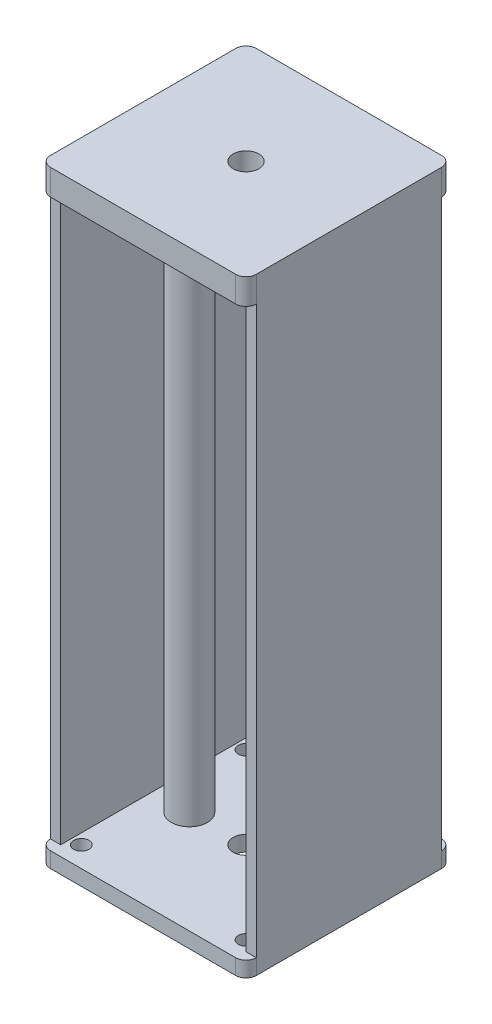
ISO-10303-21;
HEADER;
FILE_DESCRIPTION(('STEP AP214'),'2;1');
FILE_NAME('part.step','',(''),(''),'','','');
FILE_SCHEMA(('AUTOMOTIVE_DESIGN { 1 0 10303 214 1 1 1 1 }'));
ENDSEC;
DATA;
#1=APPLICATION_CONTEXT('core data for automotive mechanical design processes');
#2=APPLICATION_PROTOCOL_DEFINITION('international standard','automotive_design',2000,#1);
#3=PRODUCT_CONTEXT('',#1,'mechanical');
#4=PRODUCT('Part','Part','',(#3));
#5=PRODUCT_RELATED_PRODUCT_CATEGORY('part','',(#4));
#6=PRODUCT_DEFINITION_FORMATION('','',#4);
#7=PRODUCT_DEFINITION_CONTEXT('part definition',#1,'design');
#8=PRODUCT_DEFINITION('design','',#6,#7);
#9=PRODUCT_DEFINITION_SHAPE('','',#8);
#10=(LENGTH_UNIT() NAMED_UNIT(*) SI_UNIT(.MILLI.,.METRE.));
#11=(NAMED_UNIT(*) PLANE_ANGLE_UNIT() SI_UNIT($,.RADIAN.));
#12=(NAMED_UNIT(*) SI_UNIT($,.STERADIAN.) SOLID_ANGLE_UNIT());
#13=UNCERTAINTY_MEASURE_WITH_UNIT(LENGTH_MEASURE(1.E-05),#10,'distance_accuracy_value','');
#14=(GEOMETRIC_REPRESENTATION_CONTEXT(3) GLOBAL_UNCERTAINTY_ASSIGNED_CONTEXT((#13)) GLOBAL_UNIT_ASSIGNED_CONTEXT((#10,
#11,#12)) REPRESENTATION_CONTEXT('',''));
#15=CARTESIAN_POINT('',(0.,0.,0.));
#16=DIRECTION('',(0.,0.,1.));
#17=DIRECTION('',(1.,0.,0.));
#18=AXIS2_PLACEMENT_3D('',#15,#16,#17);
#19=CARTESIAN_POINT('',(0.,0.,0.));
#20=DIRECTION('',(0.,1.,0.));
#21=DIRECTION('',(0.,0.,1.));
#22=AXIS2_PLACEMENT_3D('',#19,#20,#21);
#23=PLANE('',#22);
#24=CARTESIAN_POINT('',(9.,0.,20.));
#25=DIRECTION('',(0.,1.,0.));
#26=DIRECTION('',(0.,0.,1.));
#27=AXIS2_PLACEMENT_3D('',#24,#25,#26);
#28=CIRCLE('',#27,3.5);
#29=CARTESIAN_POINT('',(9.,0.,23.5));
#30=VERTEX_POINT('',#29);
#31=EDGE_CURVE('E11',#30,#30,#28,.F.);
#32=ORIENTED_EDGE('',*,*,#31,.F.);
#33=EDGE_LOOP('',(#32));
#34=FACE_BOUND('',#33,.T.);
#35=CARTESIAN_POINT('',(31.,0.,20.));
#36=DIRECTION('',(0.,1.,0.));
#37=DIRECTION('',(0.,0.,1.));
#38=AXIS2_PLACEMENT_3D('',#35,#36,#37);
#39=CIRCLE('',#38,3.5);
#40=CARTESIAN_POINT('',(31.,0.,23.5));
#41=VERTEX_POINT('',#40);
#42=EDGE_CURVE('E49',#41,#41,#39,.F.);
#43=ORIENTED_EDGE('',*,*,#42,.F.);
#44=EDGE_LOOP('',(#43));
#45=FACE_BOUND('',#44,.T.);
#46=CARTESIAN_POINT('',(20.,0.,20.));
#47=DIRECTION('',(0.,1.,0.));
#48=DIRECTION('',(0.,0.,1.));
#49=AXIS2_PLACEMENT_3D('',#46,#47,#48);
#50=CIRCLE('',#49,2.5);
#51=CARTESIAN_POINT('',(20.,0.,22.5));
#52=VERTEX_POINT('',#51);
#53=EDGE_CURVE('E684',#52,#52,#50,.T.);
#54=ORIENTED_EDGE('',*,*,#53,.T.);
#55=EDGE_LOOP('',(#54));
#56=FACE_BOUND('',#55,.T.);
#57=DIRECTION('',(-1.,0.,0.));
#58=VECTOR('',#57,1.);
#59=CARTESIAN_POINT('',(2.,0.,38.));
#60=LINE('',#59,#58);
#61=CARTESIAN_POINT('',(2.,0.,38.));
#62=VERTEX_POINT('',#61);
#63=CARTESIAN_POINT('',(0.,0.,38.));
#64=VERTEX_POINT('',#63);
#65=EDGE_CURVE('E338',#62,#64,#60,.T.);
#66=ORIENTED_EDGE('',*,*,#65,.F.);
#67=DIRECTION('',(0.,0.,1.));
#68=VECTOR('',#67,1.);
#69=CARTESIAN_POINT('',(2.,0.,2.));
#70=LINE('',#69,#68);
#71=CARTESIAN_POINT('',(2.,0.,2.));
#72=VERTEX_POINT('',#71);
#73=EDGE_CURVE('E334',#72,#62,#70,.T.);
#74=ORIENTED_EDGE('',*,*,#73,.F.);
#75=DIRECTION('',(1.,0.,0.));
#76=VECTOR('',#75,1.);
#77=CARTESIAN_POINT('',(0.,0.,2.));
#78=LINE('',#77,#76);
#79=CARTESIAN_POINT('',(0.,0.,2.));
#80=VERTEX_POINT('',#79);
#81=EDGE_CURVE('E344',#80,#72,#78,.T.);
#82=ORIENTED_EDGE('',*,*,#81,.F.);
#83=CARTESIAN_POINT('',(2.,0.,2.));
#84=DIRECTION('',(0.,1.,0.));
#85=DIRECTION('',(0.,0.,1.));
#86=AXIS2_PLACEMENT_3D('',#83,#84,#85);
#87=CIRCLE('',#86,2.);
#88=CARTESIAN_POINT('',(2.,0.,0.));
#89=VERTEX_POINT('',#88);
#90=EDGE_CURVE('E251',#80,#89,#87,.F.);
#91=ORIENTED_EDGE('',*,*,#90,.T.);
#92=DIRECTION('',(-1.,0.,0.));
#93=VECTOR('',#92,1.);
#94=CARTESIAN_POINT('',(40.,0.,0.));
#95=LINE('',#94,#93);
#96=CARTESIAN_POINT('',(38.,0.,0.));
#97=VERTEX_POINT('',#96);
#98=EDGE_CURVE('E239',#97,#89,#95,.T.);
#99=ORIENTED_EDGE('',*,*,#98,.F.);
#100=CARTESIAN_POINT('',(38.,0.,2.));
#101=DIRECTION('',(0.,1.,0.));
#102=DIRECTION('',(0.,0.,1.));
#103=AXIS2_PLACEMENT_3D('',#100,#101,#102);
#104=CIRCLE('',#103,2.);
#105=CARTESIAN_POINT('',(40.,0.,2.));
#106=VERTEX_POINT('',#105);
#107=EDGE_CURVE('E255',#97,#106,#104,.F.);
#108=ORIENTED_EDGE('',*,*,#107,.T.);
#109=DIRECTION('',(1.,0.,0.));
#110=VECTOR('',#109,1.);
#111=CARTESIAN_POINT('',(38.,0.,2.));
#112=LINE('',#111,#110);
#113=CARTESIAN_POINT('',(38.,0.,2.));
#114=VERTEX_POINT('',#113);
#115=EDGE_CURVE('E212',#114,#106,#112,.T.);
#116=ORIENTED_EDGE('',*,*,#115,.F.);
#117=DIRECTION('',(0.,0.,-1.));
#118=VECTOR('',#117,1.);
#119=CARTESIAN_POINT('',(38.,0.,38.));
#120=LINE('',#119,#118);
#121=CARTESIAN_POINT('',(38.,0.,38.));
#122=VERTEX_POINT('',#121);
#123=EDGE_CURVE('E362',#122,#114,#120,.T.);
#124=ORIENTED_EDGE('',*,*,#123,.F.);
#125=DIRECTION('',(-1.,0.,0.));
#126=VECTOR('',#125,1.);
#127=CARTESIAN_POINT('',(40.,0.,38.));
#128=LINE('',#127,#126);
#129=CARTESIAN_POINT('',(40.,0.,38.));
#130=VERTEX_POINT('',#129);
#131=EDGE_CURVE('E225',#130,#122,#128,.T.);
#132=ORIENTED_EDGE('',*,*,#131,.F.);
#133=CARTESIAN_POINT('',(38.,0.,38.));
#134=DIRECTION('',(0.,1.,0.));
#135=DIRECTION('',(0.,0.,1.));
#136=AXIS2_PLACEMENT_3D('',#133,#134,#135);
#137=CIRCLE('',#136,2.);
#138=CARTESIAN_POINT('',(38.,0.,40.));
#139=VERTEX_POINT('',#138);
#140=EDGE_CURVE('E249',#130,#139,#137,.F.);
#141=ORIENTED_EDGE('',*,*,#140,.T.);
#142=DIRECTION('',(1.,0.,0.));
#143=VECTOR('',#142,1.);
#144=CARTESIAN_POINT('',(0.,0.,40.));
#145=LINE('',#144,#143);
#146=CARTESIAN_POINT('',(2.,0.,40.));
#147=VERTEX_POINT('',#146);
#148=EDGE_CURVE('E229',#147,#139,#145,.T.);
#149=ORIENTED_EDGE('',*,*,#148,.F.);
#150=CARTESIAN_POINT('',(2.,0.,38.));
#151=DIRECTION('',(0.,1.,0.));
#152=DIRECTION('',(0.,0.,1.));
#153=AXIS2_PLACEMENT_3D('',#150,#151,#152);
#154=CIRCLE('',#153,2.);
#155=EDGE_CURVE('E257',#147,#64,#154,.F.);
#156=ORIENTED_EDGE('',*,*,#155,.T.);
#157=EDGE_LOOP('',(#66,#74,#82,#91,#99,#108,#116,#124,#132,#141,#149,#156));
#158=FACE_BOUND('',#157,.T.);
#159=ADVANCED_FACE('F41',(#34,#45,#56,#158),#23,.F.);
#160=CARTESIAN_POINT('',(40.,5.,0.));
#161=DIRECTION('',(0.,0.,1.));
#162=DIRECTION('',(1.,0.,0.));
#163=AXIS2_PLACEMENT_3D('',#160,#161,#162);
#164=PLANE('',#163);
#165=ORIENTED_EDGE('',*,*,#98,.T.);
#166=DIRECTION('',(0.,-1.,0.));
#167=VECTOR('',#166,1.);
#168=CARTESIAN_POINT('',(2.,5.,0.));
#169=LINE('',#168,#167);
#170=CARTESIAN_POINT('',(2.,5.,0.));
#171=VERTEX_POINT('',#170);
#172=EDGE_CURVE('E274',#89,#171,#169,.F.);
#173=ORIENTED_EDGE('',*,*,#172,.T.);
#174=DIRECTION('',(-1.,0.,0.));
#175=VECTOR('',#174,1.);
#176=CARTESIAN_POINT('',(40.,5.,0.));
#177=LINE('',#176,#175);
#178=CARTESIAN_POINT('',(38.,5.,0.));
#179=VERTEX_POINT('',#178);
#180=EDGE_CURVE('E228',#179,#171,#177,.T.);
#181=ORIENTED_EDGE('',*,*,#180,.F.);
#182=DIRECTION('',(0.,-1.,0.));
#183=VECTOR('',#182,1.);
#184=CARTESIAN_POINT('',(38.,5.,0.));
#185=LINE('',#184,#183);
#186=EDGE_CURVE('E272',#179,#97,#185,.T.);
#187=ORIENTED_EDGE('',*,*,#186,.T.);
#188=EDGE_LOOP('',(#165,#173,#181,#187));
#189=FACE_BOUND('',#188,.T.);
#190=ADVANCED_FACE('F433',(#189),#164,.F.);
#191=CARTESIAN_POINT('',(0.,5.,0.));
#192=DIRECTION('',(1.,0.,0.));
#193=DIRECTION('',(0.,0.,-1.));
#194=AXIS2_PLACEMENT_3D('',#191,#192,#193);
#195=PLANE('',#194);
#196=DIRECTION('',(0.,1.,0.));
#197=VECTOR('',#196,1.);
#198=CARTESIAN_POINT('',(0.,-110.,2.));
#199=LINE('',#198,#197);
#200=CARTESIAN_POINT('',(0.,-110.,2.));
#201=VERTEX_POINT('',#200);
#202=EDGE_CURVE('E354',#201,#80,#199,.T.);
#203=ORIENTED_EDGE('',*,*,#202,.F.);
#204=DIRECTION('',(0.,1.,0.));
#205=VECTOR('',#204,1.);
#206=CARTESIAN_POINT('',(0.,5.,2.));
#207=LINE('',#206,#205);
#208=CARTESIAN_POINT('',(0.,-113.,2.));
#209=VERTEX_POINT('',#208);
#210=EDGE_CURVE('E292',#201,#209,#207,.F.);
#211=ORIENTED_EDGE('',*,*,#210,.T.);
#212=DIRECTION('',(0.,0.,-1.));
#213=VECTOR('',#212,1.);
#214=CARTESIAN_POINT('',(0.,-113.,0.));
#215=LINE('',#214,#213);
#216=CARTESIAN_POINT('',(0.,-113.,38.));
#217=VERTEX_POINT('',#216);
#218=EDGE_CURVE('E324',#217,#209,#215,.T.);
#219=ORIENTED_EDGE('',*,*,#218,.F.);
#220=DIRECTION('',(0.,1.,0.));
#221=VECTOR('',#220,1.);
#222=CARTESIAN_POINT('',(0.,5.,38.));
#223=LINE('',#222,#221);
#224=CARTESIAN_POINT('',(0.,-110.,38.));
#225=VERTEX_POINT('',#224);
#226=EDGE_CURVE('E286',#217,#225,#223,.T.);
#227=ORIENTED_EDGE('',*,*,#226,.T.);
#228=DIRECTION('',(0.,1.,0.));
#229=VECTOR('',#228,1.);
#230=CARTESIAN_POINT('',(0.,-110.,38.));
#231=LINE('',#230,#229);
#232=EDGE_CURVE('E243',#225,#64,#231,.T.);
#233=ORIENTED_EDGE('',*,*,#232,.T.);
#234=DIRECTION('',(0.,-1.,0.));
#235=VECTOR('',#234,1.);
#236=CARTESIAN_POINT('',(0.,5.,38.));
#237=LINE('',#236,#235);
#238=CARTESIAN_POINT('',(0.,5.,38.));
#239=VERTEX_POINT('',#238);
#240=EDGE_CURVE('E262',#64,#239,#237,.F.);
#241=ORIENTED_EDGE('',*,*,#240,.T.);
#242=DIRECTION('',(0.,0.,1.));
#243=VECTOR('',#242,1.);
#244=CARTESIAN_POINT('',(0.,5.,0.));
#245=LINE('',#244,#243);
#246=CARTESIAN_POINT('',(0.,5.,2.));
#247=VERTEX_POINT('',#246);
#248=EDGE_CURVE('E230',#247,#239,#245,.T.);
#249=ORIENTED_EDGE('',*,*,#248,.F.);
#250=DIRECTION('',(0.,-1.,0.));
#251=VECTOR('',#250,1.);
#252=CARTESIAN_POINT('',(0.,5.,2.));
#253=LINE('',#252,#251);
#254=EDGE_CURVE('E259',#247,#80,#253,.T.);
#255=ORIENTED_EDGE('',*,*,#254,.T.);
#256=EDGE_LOOP('',(#203,#211,#219,#227,#233,#241,#249,#255));
#257=FACE_BOUND('',#256,.T.);
#258=ADVANCED_FACE('F392',(#257),#195,.F.);
#259=CARTESIAN_POINT('',(0.,5.,40.));
#260=DIRECTION('',(0.,0.,-1.));
#261=DIRECTION('',(-1.,0.,0.));
#262=AXIS2_PLACEMENT_3D('',#259,#260,#261);
#263=PLANE('',#262);
#264=DIRECTION('',(1.,0.,0.));
#265=VECTOR('',#264,1.);
#266=CARTESIAN_POINT('',(0.,5.,40.));
#267=LINE('',#266,#265);
#268=CARTESIAN_POINT('',(2.,5.,40.));
#269=VERTEX_POINT('',#268);
#270=CARTESIAN_POINT('',(38.,5.,40.));
#271=VERTEX_POINT('',#270);
#272=EDGE_CURVE('E231',#269,#271,#267,.T.);
#273=ORIENTED_EDGE('',*,*,#272,.F.);
#274=DIRECTION('',(0.,-1.,0.));
#275=VECTOR('',#274,1.);
#276=CARTESIAN_POINT('',(2.,5.,40.));
#277=LINE('',#276,#275);
#278=EDGE_CURVE('E250',#269,#147,#277,.T.);
#279=ORIENTED_EDGE('',*,*,#278,.T.);
#280=ORIENTED_EDGE('',*,*,#148,.T.);
#281=DIRECTION('',(0.,-1.,0.));
#282=VECTOR('',#281,1.);
#283=CARTESIAN_POINT('',(38.,5.,40.));
#284=LINE('',#283,#282);
#285=EDGE_CURVE('E237',#139,#271,#284,.F.);
#286=ORIENTED_EDGE('',*,*,#285,.T.);
#287=EDGE_LOOP('',(#273,#279,#280,#286));
#288=FACE_BOUND('',#287,.T.);
#289=ADVANCED_FACE('F423',(#288),#263,.F.);
#290=CARTESIAN_POINT('',(40.,5.,40.));
#291=DIRECTION('',(-1.,0.,0.));
#292=DIRECTION('',(0.,0.,1.));
#293=AXIS2_PLACEMENT_3D('',#290,#291,#292);
#294=PLANE('',#293);
#295=DIRECTION('',(0.,0.,1.));
#296=VECTOR('',#295,1.);
#297=CARTESIAN_POINT('',(40.,-113.,0.));
#298=LINE('',#297,#296);
#299=CARTESIAN_POINT('',(40.,-113.,2.));
#300=VERTEX_POINT('',#299);
#301=CARTESIAN_POINT('',(40.,-113.,38.));
#302=VERTEX_POINT('',#301);
#303=EDGE_CURVE('E202',#300,#302,#298,.T.);
#304=ORIENTED_EDGE('',*,*,#303,.F.);
#305=DIRECTION('',(0.,1.,0.));
#306=VECTOR('',#305,1.);
#307=CARTESIAN_POINT('',(40.,5.,2.));
#308=LINE('',#307,#306);
#309=CARTESIAN_POINT('',(40.,-110.,2.));
#310=VERTEX_POINT('',#309);
#311=EDGE_CURVE('E187',#300,#310,#308,.T.);
#312=ORIENTED_EDGE('',*,*,#311,.T.);
#313=DIRECTION('',(0.,1.,0.));
#314=VECTOR('',#313,1.);
#315=CARTESIAN_POINT('',(40.,-110.,2.));
#316=LINE('',#315,#314);
#317=EDGE_CURVE('E198',#310,#106,#316,.T.);
#318=ORIENTED_EDGE('',*,*,#317,.T.);
#319=DIRECTION('',(0.,-1.,0.));
#320=VECTOR('',#319,1.);
#321=CARTESIAN_POINT('',(40.,5.,2.));
#322=LINE('',#321,#320);
#323=CARTESIAN_POINT('',(40.,5.,2.));
#324=VERTEX_POINT('',#323);
#325=EDGE_CURVE('E276',#106,#324,#322,.F.);
#326=ORIENTED_EDGE('',*,*,#325,.T.);
#327=DIRECTION('',(0.,0.,-1.));
#328=VECTOR('',#327,1.);
#329=CARTESIAN_POINT('',(40.,5.,40.));
#330=LINE('',#329,#328);
#331=CARTESIAN_POINT('',(40.,5.,38.));
#332=VERTEX_POINT('',#331);
#333=EDGE_CURVE('E236',#332,#324,#330,.T.);
#334=ORIENTED_EDGE('',*,*,#333,.F.);
#335=DIRECTION('',(0.,-1.,0.));
#336=VECTOR('',#335,1.);
#337=CARTESIAN_POINT('',(40.,5.,38.));
#338=LINE('',#337,#336);
#339=EDGE_CURVE('E277',#332,#130,#338,.T.);
#340=ORIENTED_EDGE('',*,*,#339,.T.);
#341=DIRECTION('',(0.,1.,0.));
#342=VECTOR('',#341,1.);
#343=CARTESIAN_POINT('',(40.,-110.,38.));
#344=LINE('',#343,#342);
#345=CARTESIAN_POINT('',(40.,-110.,38.));
#346=VERTEX_POINT('',#345);
#347=EDGE_CURVE('E356',#346,#130,#344,.T.);
#348=ORIENTED_EDGE('',*,*,#347,.F.);
#349=DIRECTION('',(0.,1.,0.));
#350=VECTOR('',#349,1.);
#351=CARTESIAN_POINT('',(40.,5.,38.));
#352=LINE('',#351,#350);
#353=EDGE_CURVE('E205',#346,#302,#352,.F.);
#354=ORIENTED_EDGE('',*,*,#353,.T.);
#355=EDGE_LOOP('',(#304,#312,#318,#326,#334,#340,#348,#354));
#356=FACE_BOUND('',#355,.T.);
#357=ADVANCED_FACE('F196',(#356),#294,.F.);
#358=CARTESIAN_POINT('',(0.,5.,0.));
#359=DIRECTION('',(0.,1.,0.));
#360=DIRECTION('',(0.,0.,1.));
#361=AXIS2_PLACEMENT_3D('',#358,#359,#360);
#362=PLANE('',#361);
#363=CARTESIAN_POINT('',(20.,5.,20.));
#364=DIRECTION('',(0.,1.,0.));
#365=DIRECTION('',(0.,0.,1.));
#366=AXIS2_PLACEMENT_3D('',#363,#364,#365);
#367=CIRCLE('',#366,2.5);
#368=CARTESIAN_POINT('',(20.,5.,22.5));
#369=VERTEX_POINT('',#368);
#370=EDGE_CURVE('E690',#369,#369,#367,.T.);
#371=ORIENTED_EDGE('',*,*,#370,.F.);
#372=EDGE_LOOP('',(#371));
#373=FACE_BOUND('',#372,.T.);
#374=ORIENTED_EDGE('',*,*,#248,.T.);
#375=CARTESIAN_POINT('',(2.,5.,38.));
#376=DIRECTION('',(0.,1.,0.));
#377=DIRECTION('',(0.,0.,1.));
#378=AXIS2_PLACEMENT_3D('',#375,#376,#377);
#379=CIRCLE('',#378,2.);
#380=EDGE_CURVE('E266',#239,#269,#379,.T.);
#381=ORIENTED_EDGE('',*,*,#380,.T.);
#382=ORIENTED_EDGE('',*,*,#272,.T.);
#383=CARTESIAN_POINT('',(38.,5.,38.));
#384=DIRECTION('',(0.,1.,0.));
#385=DIRECTION('',(0.,0.,1.));
#386=AXIS2_PLACEMENT_3D('',#383,#384,#385);
#387=CIRCLE('',#386,2.);
#388=EDGE_CURVE('E265',#271,#332,#387,.T.);
#389=ORIENTED_EDGE('',*,*,#388,.T.);
#390=ORIENTED_EDGE('',*,*,#333,.T.);
#391=CARTESIAN_POINT('',(38.,5.,2.));
#392=DIRECTION('',(0.,1.,0.));
#393=DIRECTION('',(0.,0.,1.));
#394=AXIS2_PLACEMENT_3D('',#391,#392,#393);
#395=CIRCLE('',#394,2.);
#396=EDGE_CURVE('E263',#324,#179,#395,.T.);
#397=ORIENTED_EDGE('',*,*,#396,.T.);
#398=ORIENTED_EDGE('',*,*,#180,.T.);
#399=CARTESIAN_POINT('',(2.,5.,2.));
#400=DIRECTION('',(0.,1.,0.));
#401=DIRECTION('',(0.,0.,1.));
#402=AXIS2_PLACEMENT_3D('',#399,#400,#401);
#403=CIRCLE('',#402,2.);
#404=EDGE_CURVE('E270',#171,#247,#403,.T.);
#405=ORIENTED_EDGE('',*,*,#404,.T.);
#406=EDGE_LOOP('',(#374,#381,#382,#389,#390,#397,#398,#405));
#407=FACE_BOUND('',#406,.T.);
#408=ADVANCED_FACE('F413',(#373,#407),#362,.T.);
#409=CARTESIAN_POINT('',(2.,5.,38.));
#410=DIRECTION('',(0.,-1.,0.));
#411=DIRECTION('',(0.,0.,-1.));
#412=AXIS2_PLACEMENT_3D('',#409,#410,#411);
#413=CYLINDRICAL_SURFACE('',#412,2.);
#414=ORIENTED_EDGE('',*,*,#380,.F.);
#415=ORIENTED_EDGE('',*,*,#240,.F.);
#416=ORIENTED_EDGE('',*,*,#155,.F.);
#417=ORIENTED_EDGE('',*,*,#278,.F.);
#418=EDGE_LOOP('',(#414,#415,#416,#417));
#419=FACE_BOUND('',#418,.T.);
#420=ADVANCED_FACE('F416',(#419),#413,.T.);
#421=CARTESIAN_POINT('',(2.,5.,2.));
#422=DIRECTION('',(0.,-1.,0.));
#423=DIRECTION('',(0.,0.,-1.));
#424=AXIS2_PLACEMENT_3D('',#421,#422,#423);
#425=CYLINDRICAL_SURFACE('',#424,2.);
#426=ORIENTED_EDGE('',*,*,#404,.F.);
#427=ORIENTED_EDGE('',*,*,#172,.F.);
#428=ORIENTED_EDGE('',*,*,#90,.F.);
#429=ORIENTED_EDGE('',*,*,#254,.F.);
#430=EDGE_LOOP('',(#426,#427,#428,#429));
#431=FACE_BOUND('',#430,.T.);
#432=ADVANCED_FACE('F412',(#431),#425,.T.);
#433=CARTESIAN_POINT('',(38.,5.,2.));
#434=DIRECTION('',(0.,-1.,0.));
#435=DIRECTION('',(0.,0.,-1.));
#436=AXIS2_PLACEMENT_3D('',#433,#434,#435);
#437=CYLINDRICAL_SURFACE('',#436,2.);
#438=ORIENTED_EDGE('',*,*,#396,.F.);
#439=ORIENTED_EDGE('',*,*,#325,.F.);
#440=ORIENTED_EDGE('',*,*,#107,.F.);
#441=ORIENTED_EDGE('',*,*,#186,.F.);
#442=EDGE_LOOP('',(#438,#439,#440,#441));
#443=FACE_BOUND('',#442,.T.);
#444=ADVANCED_FACE('F429',(#443),#437,.T.);
#445=CARTESIAN_POINT('',(38.,5.,38.));
#446=DIRECTION('',(0.,-1.,0.));
#447=DIRECTION('',(0.,0.,-1.));
#448=AXIS2_PLACEMENT_3D('',#445,#446,#447);
#449=CYLINDRICAL_SURFACE('',#448,2.);
#450=ORIENTED_EDGE('',*,*,#388,.F.);
#451=ORIENTED_EDGE('',*,*,#285,.F.);
#452=ORIENTED_EDGE('',*,*,#140,.F.);
#453=ORIENTED_EDGE('',*,*,#339,.F.);
#454=EDGE_LOOP('',(#450,#451,#452,#453));
#455=FACE_BOUND('',#454,.T.);
#456=ADVANCED_FACE('F424',(#455),#449,.T.);
#457=CARTESIAN_POINT('',(40.,-110.,38.));
#458=DIRECTION('',(0.,0.,-1.));
#459=DIRECTION('',(-1.,0.,0.));
#460=AXIS2_PLACEMENT_3D('',#457,#458,#459);
#461=PLANE('',#460);
#462=ORIENTED_EDGE('',*,*,#131,.T.);
#463=DIRECTION('',(0.,1.,0.));
#464=VECTOR('',#463,1.);
#465=CARTESIAN_POINT('',(38.,-110.,38.));
#466=LINE('',#465,#464);
#467=CARTESIAN_POINT('',(38.,-110.,38.));
#468=VERTEX_POINT('',#467);
#469=EDGE_CURVE('E363',#468,#122,#466,.T.);
#470=ORIENTED_EDGE('',*,*,#469,.F.);
#471=DIRECTION('',(-1.,0.,0.));
#472=VECTOR('',#471,1.);
#473=CARTESIAN_POINT('',(40.,-110.,38.));
#474=LINE('',#473,#472);
#475=EDGE_CURVE('E216',#346,#468,#474,.T.);
#476=ORIENTED_EDGE('',*,*,#475,.F.);
#477=ORIENTED_EDGE('',*,*,#347,.T.);
#478=EDGE_LOOP('',(#462,#470,#476,#477));
#479=FACE_BOUND('',#478,.T.);
#480=ADVANCED_FACE('F369',(#479),#461,.F.);
#481=CARTESIAN_POINT('',(38.,-110.,38.));
#482=DIRECTION('',(1.,0.,0.));
#483=DIRECTION('',(0.,0.,-1.));
#484=AXIS2_PLACEMENT_3D('',#481,#482,#483);
#485=PLANE('',#484);
#486=ORIENTED_EDGE('',*,*,#123,.T.);
#487=DIRECTION('',(0.,1.,0.));
#488=VECTOR('',#487,1.);
#489=CARTESIAN_POINT('',(38.,-110.,2.));
#490=LINE('',#489,#488);
#491=CARTESIAN_POINT('',(38.,-110.,2.));
#492=VERTEX_POINT('',#491);
#493=EDGE_CURVE('E215',#492,#114,#490,.T.);
#494=ORIENTED_EDGE('',*,*,#493,.F.);
#495=DIRECTION('',(0.,0.,-1.));
#496=VECTOR('',#495,1.);
#497=CARTESIAN_POINT('',(38.,-110.,38.));
#498=LINE('',#497,#496);
#499=EDGE_CURVE('E219',#468,#492,#498,.T.);
#500=ORIENTED_EDGE('',*,*,#499,.F.);
#501=ORIENTED_EDGE('',*,*,#469,.T.);
#502=EDGE_LOOP('',(#486,#494,#500,#501));
#503=FACE_BOUND('',#502,.T.);
#504=ADVANCED_FACE('F374',(#503),#485,.F.);
#505=CARTESIAN_POINT('',(38.,-110.,2.));
#506=DIRECTION('',(0.,0.,1.));
#507=DIRECTION('',(1.,0.,0.));
#508=AXIS2_PLACEMENT_3D('',#505,#506,#507);
#509=PLANE('',#508);
#510=ORIENTED_EDGE('',*,*,#115,.T.);
#511=ORIENTED_EDGE('',*,*,#317,.F.);
#512=DIRECTION('',(1.,0.,0.));
#513=VECTOR('',#512,1.);
#514=CARTESIAN_POINT('',(38.,-110.,2.));
#515=LINE('',#514,#513);
#516=EDGE_CURVE('E209',#492,#310,#515,.T.);
#517=ORIENTED_EDGE('',*,*,#516,.F.);
#518=ORIENTED_EDGE('',*,*,#493,.T.);
#519=EDGE_LOOP('',(#510,#511,#517,#518));
#520=FACE_BOUND('',#519,.T.);
#521=ADVANCED_FACE('F210',(#520),#509,.F.);
#522=CARTESIAN_POINT('',(2.,-110.,38.));
#523=DIRECTION('',(0.,0.,-1.));
#524=DIRECTION('',(-1.,0.,0.));
#525=AXIS2_PLACEMENT_3D('',#522,#523,#524);
#526=PLANE('',#525);
#527=ORIENTED_EDGE('',*,*,#65,.T.);
#528=ORIENTED_EDGE('',*,*,#232,.F.);
#529=DIRECTION('',(-1.,0.,0.));
#530=VECTOR('',#529,1.);
#531=CARTESIAN_POINT('',(2.,-110.,38.));
#532=LINE('',#531,#530);
#533=CARTESIAN_POINT('',(2.,-110.,38.));
#534=VERTEX_POINT('',#533);
#535=EDGE_CURVE('E326',#534,#225,#532,.T.);
#536=ORIENTED_EDGE('',*,*,#535,.F.);
#537=DIRECTION('',(0.,1.,0.));
#538=VECTOR('',#537,1.);
#539=CARTESIAN_POINT('',(2.,-110.,38.));
#540=LINE('',#539,#538);
#541=EDGE_CURVE('E339',#534,#62,#540,.T.);
#542=ORIENTED_EDGE('',*,*,#541,.T.);
#543=EDGE_LOOP('',(#527,#528,#536,#542));
#544=FACE_BOUND('',#543,.T.);
#545=ADVANCED_FACE('F391',(#544),#526,.F.);
#546=CARTESIAN_POINT('',(0.,-110.,2.));
#547=DIRECTION('',(0.,0.,1.));
#548=DIRECTION('',(1.,0.,0.));
#549=AXIS2_PLACEMENT_3D('',#546,#547,#548);
#550=PLANE('',#549);
#551=ORIENTED_EDGE('',*,*,#81,.T.);
#552=DIRECTION('',(0.,1.,0.));
#553=VECTOR('',#552,1.);
#554=CARTESIAN_POINT('',(2.,-110.,2.));
#555=LINE('',#554,#553);
#556=CARTESIAN_POINT('',(2.,-110.,2.));
#557=VERTEX_POINT('',#556);
#558=EDGE_CURVE('E348',#557,#72,#555,.T.);
#559=ORIENTED_EDGE('',*,*,#558,.F.);
#560=DIRECTION('',(1.,0.,0.));
#561=VECTOR('',#560,1.);
#562=CARTESIAN_POINT('',(0.,-110.,2.));
#563=LINE('',#562,#561);
#564=EDGE_CURVE('E335',#201,#557,#563,.T.);
#565=ORIENTED_EDGE('',*,*,#564,.F.);
#566=ORIENTED_EDGE('',*,*,#202,.T.);
#567=EDGE_LOOP('',(#551,#559,#565,#566));
#568=FACE_BOUND('',#567,.T.);
#569=ADVANCED_FACE('F401',(#568),#550,.F.);
#570=CARTESIAN_POINT('',(2.,-110.,2.));
#571=DIRECTION('',(-1.,0.,0.));
#572=DIRECTION('',(0.,0.,1.));
#573=AXIS2_PLACEMENT_3D('',#570,#571,#572);
#574=PLANE('',#573);
#575=ORIENTED_EDGE('',*,*,#73,.T.);
#576=ORIENTED_EDGE('',*,*,#541,.F.);
#577=DIRECTION('',(0.,0.,1.));
#578=VECTOR('',#577,1.);
#579=CARTESIAN_POINT('',(2.,-110.,2.));
#580=LINE('',#579,#578);
#581=EDGE_CURVE('E337',#557,#534,#580,.T.);
#582=ORIENTED_EDGE('',*,*,#581,.F.);
#583=ORIENTED_EDGE('',*,*,#558,.T.);
#584=EDGE_LOOP('',(#575,#576,#582,#583));
#585=FACE_BOUND('',#584,.T.);
#586=ADVANCED_FACE('F396',(#585),#574,.F.);
#587=CARTESIAN_POINT('',(0.,-113.,0.));
#588=DIRECTION('',(0.,0.,1.));
#589=DIRECTION('',(1.,0.,0.));
#590=AXIS2_PLACEMENT_3D('',#587,#588,#589);
#591=PLANE('',#590);
#592=DIRECTION('',(1.,0.,0.));
#593=VECTOR('',#592,1.);
#594=CARTESIAN_POINT('',(0.,-113.,0.));
#595=LINE('',#594,#593);
#596=CARTESIAN_POINT('',(2.,-113.,0.));
#597=VERTEX_POINT('',#596);
#598=CARTESIAN_POINT('',(38.,-113.,0.));
#599=VERTEX_POINT('',#598);
#600=EDGE_CURVE('E710',#597,#599,#595,.T.);
#601=ORIENTED_EDGE('',*,*,#600,.F.);
#602=DIRECTION('',(0.,1.,0.));
#603=VECTOR('',#602,1.);
#604=CARTESIAN_POINT('',(2.,-113.,0.));
#605=LINE('',#604,#603);
#606=CARTESIAN_POINT('',(2.,-110.,0.));
#607=VERTEX_POINT('',#606);
#608=EDGE_CURVE('E284',#597,#607,#605,.T.);
#609=ORIENTED_EDGE('',*,*,#608,.T.);
#610=DIRECTION('',(1.,0.,0.));
#611=VECTOR('',#610,1.);
#612=CARTESIAN_POINT('',(0.,-110.,0.));
#613=LINE('',#612,#611);
#614=CARTESIAN_POINT('',(38.,-110.,0.));
#615=VERTEX_POINT('',#614);
#616=EDGE_CURVE('E320',#607,#615,#613,.T.);
#617=ORIENTED_EDGE('',*,*,#616,.T.);
#618=DIRECTION('',(0.,1.,0.));
#619=VECTOR('',#618,1.);
#620=CARTESIAN_POINT('',(38.,-113.,0.));
#621=LINE('',#620,#619);
#622=EDGE_CURVE('E190',#615,#599,#621,.F.);
#623=ORIENTED_EDGE('',*,*,#622,.T.);
#624=EDGE_LOOP('',(#601,#609,#617,#623));
#625=FACE_BOUND('',#624,.T.);
#626=ADVANCED_FACE('F490',(#625),#591,.F.);
#627=CARTESIAN_POINT('',(0.,-113.,40.));
#628=DIRECTION('',(0.,0.,-1.));
#629=DIRECTION('',(-1.,0.,0.));
#630=AXIS2_PLACEMENT_3D('',#627,#628,#629);
#631=PLANE('',#630);
#632=DIRECTION('',(-1.,0.,0.));
#633=VECTOR('',#632,1.);
#634=CARTESIAN_POINT('',(0.,-113.,40.));
#635=LINE('',#634,#633);
#636=CARTESIAN_POINT('',(38.,-113.,40.));
#637=VERTEX_POINT('',#636);
#638=CARTESIAN_POINT('',(2.,-113.,40.));
#639=VERTEX_POINT('',#638);
#640=EDGE_CURVE('E327',#637,#639,#635,.T.);
#641=ORIENTED_EDGE('',*,*,#640,.F.);
#642=DIRECTION('',(0.,1.,0.));
#643=VECTOR('',#642,1.);
#644=CARTESIAN_POINT('',(38.,-113.,40.));
#645=LINE('',#644,#643);
#646=CARTESIAN_POINT('',(38.,-110.,40.));
#647=VERTEX_POINT('',#646);
#648=EDGE_CURVE('E303',#637,#647,#645,.T.);
#649=ORIENTED_EDGE('',*,*,#648,.T.);
#650=DIRECTION('',(-1.,0.,0.));
#651=VECTOR('',#650,1.);
#652=CARTESIAN_POINT('',(0.,-110.,40.));
#653=LINE('',#652,#651);
#654=CARTESIAN_POINT('',(2.,-110.,40.));
#655=VERTEX_POINT('',#654);
#656=EDGE_CURVE('E318',#647,#655,#653,.T.);
#657=ORIENTED_EDGE('',*,*,#656,.T.);
#658=DIRECTION('',(0.,1.,0.));
#659=VECTOR('',#658,1.);
#660=CARTESIAN_POINT('',(2.,-113.,40.));
#661=LINE('',#660,#659);
#662=EDGE_CURVE('E59',#655,#639,#661,.F.);
#663=ORIENTED_EDGE('',*,*,#662,.T.);
#664=EDGE_LOOP('',(#641,#649,#657,#663));
#665=FACE_BOUND('',#664,.T.);
#666=ADVANCED_FACE('F384',(#665),#631,.F.);
#667=CARTESIAN_POINT('',(0.,-113.,0.));
#668=DIRECTION('',(0.,1.,0.));
#669=DIRECTION('',(0.,0.,1.));
#670=AXIS2_PLACEMENT_3D('',#667,#668,#669);
#671=PLANE('',#670);
#672=CARTESIAN_POINT('',(20.,-113.,20.));
#673=DIRECTION('',(0.,-1.,0.));
#674=DIRECTION('',(0.,0.,-1.));
#675=AXIS2_PLACEMENT_3D('',#672,#673,#674);
#676=CIRCLE('',#675,2.5);
#677=CARTESIAN_POINT('',(20.,-113.,17.5));
#678=VERTEX_POINT('',#677);
#679=EDGE_CURVE('E693',#678,#678,#676,.T.);
#680=ORIENTED_EDGE('',*,*,#679,.F.);
#681=EDGE_LOOP('',(#680));
#682=FACE_BOUND('',#681,.T.);
#683=CARTESIAN_POINT('',(36.,-113.,4.00000000000001));
#684=DIRECTION('',(0.,-1.,0.));
#685=DIRECTION('',(0.,0.,-1.));
#686=AXIS2_PLACEMENT_3D('',#683,#684,#685);
#687=CIRCLE('',#686,1.5);
#688=CARTESIAN_POINT('',(36.,-113.,2.5));
#689=VERTEX_POINT('',#688);
#690=EDGE_CURVE('E697',#689,#689,#687,.T.);
#691=ORIENTED_EDGE('',*,*,#690,.F.);
#692=EDGE_LOOP('',(#691));
#693=FACE_BOUND('',#692,.T.);
#694=CARTESIAN_POINT('',(4.,-113.,36.));
#695=DIRECTION('',(0.,-1.,0.));
#696=DIRECTION('',(0.,0.,-1.));
#697=AXIS2_PLACEMENT_3D('',#694,#695,#696);
#698=CIRCLE('',#697,1.5);
#699=CARTESIAN_POINT('',(4.,-113.,34.5));
#700=VERTEX_POINT('',#699);
#701=EDGE_CURVE('E698',#700,#700,#698,.T.);
#702=ORIENTED_EDGE('',*,*,#701,.F.);
#703=EDGE_LOOP('',(#702));
#704=FACE_BOUND('',#703,.T.);
#705=CARTESIAN_POINT('',(36.,-113.,36.));
#706=DIRECTION('',(0.,-1.,0.));
#707=DIRECTION('',(0.,0.,-1.));
#708=AXIS2_PLACEMENT_3D('',#705,#706,#707);
#709=CIRCLE('',#708,1.5);
#710=CARTESIAN_POINT('',(36.,-113.,34.5));
#711=VERTEX_POINT('',#710);
#712=EDGE_CURVE('E687',#711,#711,#709,.T.);
#713=ORIENTED_EDGE('',*,*,#712,.F.);
#714=EDGE_LOOP('',(#713));
#715=FACE_BOUND('',#714,.T.);
#716=CARTESIAN_POINT('',(4.,-113.,4.));
#717=DIRECTION('',(0.,-1.,0.));
#718=DIRECTION('',(0.,0.,-1.));
#719=AXIS2_PLACEMENT_3D('',#716,#717,#718);
#720=CIRCLE('',#719,1.5);
#721=CARTESIAN_POINT('',(4.,-113.,2.5));
#722=VERTEX_POINT('',#721);
#723=EDGE_CURVE('E309',#722,#722,#720,.T.);
#724=ORIENTED_EDGE('',*,*,#723,.F.);
#725=EDGE_LOOP('',(#724));
#726=FACE_BOUND('',#725,.T.);
#727=ORIENTED_EDGE('',*,*,#218,.T.);
#728=CARTESIAN_POINT('',(2.,-113.,2.));
#729=DIRECTION('',(0.,1.,0.));
#730=DIRECTION('',(0.,0.,1.));
#731=AXIS2_PLACEMENT_3D('',#728,#729,#730);
#732=CIRCLE('',#731,2.);
#733=EDGE_CURVE('E299',#209,#597,#732,.F.);
#734=ORIENTED_EDGE('',*,*,#733,.T.);
#735=ORIENTED_EDGE('',*,*,#600,.T.);
#736=CARTESIAN_POINT('',(38.,-113.,2.));
#737=DIRECTION('',(0.,1.,0.));
#738=DIRECTION('',(0.,0.,1.));
#739=AXIS2_PLACEMENT_3D('',#736,#737,#738);
#740=CIRCLE('',#739,2.);
#741=EDGE_CURVE('E300',#599,#300,#740,.F.);
#742=ORIENTED_EDGE('',*,*,#741,.T.);
#743=ORIENTED_EDGE('',*,*,#303,.T.);
#744=CARTESIAN_POINT('',(38.,-113.,38.));
#745=DIRECTION('',(0.,1.,0.));
#746=DIRECTION('',(0.,0.,1.));
#747=AXIS2_PLACEMENT_3D('',#744,#745,#746);
#748=CIRCLE('',#747,2.);
#749=EDGE_CURVE('E63',#302,#637,#748,.F.);
#750=ORIENTED_EDGE('',*,*,#749,.T.);
#751=ORIENTED_EDGE('',*,*,#640,.T.);
#752=CARTESIAN_POINT('',(2.,-113.,38.));
#753=DIRECTION('',(0.,1.,0.));
#754=DIRECTION('',(0.,0.,1.));
#755=AXIS2_PLACEMENT_3D('',#752,#753,#754);
#756=CIRCLE('',#755,2.);
#757=EDGE_CURVE('E295',#639,#217,#756,.F.);
#758=ORIENTED_EDGE('',*,*,#757,.T.);
#759=EDGE_LOOP('',(#727,#734,#735,#742,#743,#750,#751,#758));
#760=FACE_BOUND('',#759,.T.);
#761=ADVANCED_FACE('F478',(#682,#693,#704,#715,#726,#760),#671,.F.);
#762=CARTESIAN_POINT('',(0.,-110.,0.));
#763=DIRECTION('',(0.,1.,0.));
#764=DIRECTION('',(0.,0.,1.));
#765=AXIS2_PLACEMENT_3D('',#762,#763,#764);
#766=PLANE('',#765);
#767=CARTESIAN_POINT('',(9.,-110.,20.));
#768=DIRECTION('',(0.,1.,0.));
#769=DIRECTION('',(0.,0.,1.));
#770=AXIS2_PLACEMENT_3D('',#767,#768,#769);
#771=CIRCLE('',#770,3.5);
#772=CARTESIAN_POINT('',(9.,-110.,23.5));
#773=VERTEX_POINT('',#772);
#774=EDGE_CURVE('E680',#773,#773,#771,.T.);
#775=ORIENTED_EDGE('',*,*,#774,.F.);
#776=EDGE_LOOP('',(#775));
#777=FACE_BOUND('',#776,.T.);
#778=CARTESIAN_POINT('',(31.,-110.,20.));
#779=DIRECTION('',(0.,1.,0.));
#780=DIRECTION('',(0.,0.,1.));
#781=AXIS2_PLACEMENT_3D('',#778,#779,#780);
#782=CIRCLE('',#781,3.5);
#783=CARTESIAN_POINT('',(31.,-110.,23.5));
#784=VERTEX_POINT('',#783);
#785=EDGE_CURVE('E727',#784,#784,#782,.T.);
#786=ORIENTED_EDGE('',*,*,#785,.F.);
#787=EDGE_LOOP('',(#786));
#788=FACE_BOUND('',#787,.T.);
#789=CARTESIAN_POINT('',(20.,-110.,20.));
#790=DIRECTION('',(0.,1.,0.));
#791=DIRECTION('',(0.,0.,1.));
#792=AXIS2_PLACEMENT_3D('',#789,#790,#791);
#793=CIRCLE('',#792,2.5);
#794=CARTESIAN_POINT('',(20.,-110.,17.5));
#795=VERTEX_POINT('',#794);
#796=EDGE_CURVE('E44',#795,#795,#793,.T.);
#797=ORIENTED_EDGE('',*,*,#796,.F.);
#798=EDGE_LOOP('',(#797));
#799=FACE_BOUND('',#798,.T.);
#800=CARTESIAN_POINT('',(36.,-110.,4.00000000000001));
#801=DIRECTION('',(0.,1.,0.));
#802=DIRECTION('',(0.,0.,1.));
#803=AXIS2_PLACEMENT_3D('',#800,#801,#802);
#804=CIRCLE('',#803,1.5);
#805=CARTESIAN_POINT('',(36.,-110.,5.50000000000001));
#806=VERTEX_POINT('',#805);
#807=EDGE_CURVE('E314',#806,#806,#804,.T.);
#808=ORIENTED_EDGE('',*,*,#807,.F.);
#809=EDGE_LOOP('',(#808));
#810=FACE_BOUND('',#809,.T.);
#811=CARTESIAN_POINT('',(4.,-110.,36.));
#812=DIRECTION('',(0.,1.,0.));
#813=DIRECTION('',(0.,0.,1.));
#814=AXIS2_PLACEMENT_3D('',#811,#812,#813);
#815=CIRCLE('',#814,1.5);
#816=CARTESIAN_POINT('',(4.,-110.,37.5));
#817=VERTEX_POINT('',#816);
#818=EDGE_CURVE('E312',#817,#817,#815,.T.);
#819=ORIENTED_EDGE('',*,*,#818,.F.);
#820=EDGE_LOOP('',(#819));
#821=FACE_BOUND('',#820,.T.);
#822=CARTESIAN_POINT('',(36.,-110.,36.));
#823=DIRECTION('',(0.,1.,0.));
#824=DIRECTION('',(0.,0.,1.));
#825=AXIS2_PLACEMENT_3D('',#822,#823,#824);
#826=CIRCLE('',#825,1.5);
#827=CARTESIAN_POINT('',(36.,-110.,37.5));
#828=VERTEX_POINT('',#827);
#829=EDGE_CURVE('E307',#828,#828,#826,.T.);
#830=ORIENTED_EDGE('',*,*,#829,.F.);
#831=EDGE_LOOP('',(#830));
#832=FACE_BOUND('',#831,.T.);
#833=CARTESIAN_POINT('',(4.,-110.,4.));
#834=DIRECTION('',(0.,1.,0.));
#835=DIRECTION('',(0.,0.,1.));
#836=AXIS2_PLACEMENT_3D('',#833,#834,#835);
#837=CIRCLE('',#836,1.5);
#838=CARTESIAN_POINT('',(4.,-110.,5.5));
#839=VERTEX_POINT('',#838);
#840=EDGE_CURVE('E306',#839,#839,#837,.T.);
#841=ORIENTED_EDGE('',*,*,#840,.F.);
#842=EDGE_LOOP('',(#841));
#843=FACE_BOUND('',#842,.T.);
#844=ORIENTED_EDGE('',*,*,#616,.F.);
#845=CARTESIAN_POINT('',(2.,-110.,2.));
#846=DIRECTION('',(0.,1.,0.));
#847=DIRECTION('',(0.,0.,1.));
#848=AXIS2_PLACEMENT_3D('',#845,#846,#847);
#849=CIRCLE('',#848,2.);
#850=EDGE_CURVE('E195',#607,#201,#849,.T.);
#851=ORIENTED_EDGE('',*,*,#850,.T.);
#852=ORIENTED_EDGE('',*,*,#564,.T.);
#853=ORIENTED_EDGE('',*,*,#581,.T.);
#854=ORIENTED_EDGE('',*,*,#535,.T.);
#855=CARTESIAN_POINT('',(2.,-110.,38.));
#856=DIRECTION('',(0.,1.,0.));
#857=DIRECTION('',(0.,0.,1.));
#858=AXIS2_PLACEMENT_3D('',#855,#856,#857);
#859=CIRCLE('',#858,2.);
#860=EDGE_CURVE('E283',#225,#655,#859,.T.);
#861=ORIENTED_EDGE('',*,*,#860,.T.);
#862=ORIENTED_EDGE('',*,*,#656,.F.);
#863=CARTESIAN_POINT('',(38.,-110.,38.));
#864=DIRECTION('',(0.,1.,0.));
#865=DIRECTION('',(0.,0.,1.));
#866=AXIS2_PLACEMENT_3D('',#863,#864,#865);
#867=CIRCLE('',#866,2.);
#868=EDGE_CURVE('E194',#647,#346,#867,.T.);
#869=ORIENTED_EDGE('',*,*,#868,.T.);
#870=ORIENTED_EDGE('',*,*,#475,.T.);
#871=ORIENTED_EDGE('',*,*,#499,.T.);
#872=ORIENTED_EDGE('',*,*,#516,.T.);
#873=CARTESIAN_POINT('',(38.,-110.,2.));
#874=DIRECTION('',(0.,1.,0.));
#875=DIRECTION('',(0.,0.,1.));
#876=AXIS2_PLACEMENT_3D('',#873,#874,#875);
#877=CIRCLE('',#876,2.);
#878=EDGE_CURVE('E185',#310,#615,#877,.T.);
#879=ORIENTED_EDGE('',*,*,#878,.T.);
#880=EDGE_LOOP('',(#844,#851,#852,#853,#854,#861,#862,#869,#870,#871,#872,#879));
#881=FACE_BOUND('',#880,.T.);
#882=ADVANCED_FACE('F211',(#777,#788,#799,#810,#821,#832,#843,#881),#766,.T.);
#883=CARTESIAN_POINT('',(2.,-113.,2.));
#884=DIRECTION('',(0.,1.,0.));
#885=DIRECTION('',(0.,0.,1.));
#886=AXIS2_PLACEMENT_3D('',#883,#884,#885);
#887=CYLINDRICAL_SURFACE('',#886,2.);
#888=ORIENTED_EDGE('',*,*,#733,.F.);
#889=ORIENTED_EDGE('',*,*,#210,.F.);
#890=ORIENTED_EDGE('',*,*,#850,.F.);
#891=ORIENTED_EDGE('',*,*,#608,.F.);
#892=EDGE_LOOP('',(#888,#889,#890,#891));
#893=FACE_BOUND('',#892,.T.);
#894=ADVANCED_FACE('F451',(#893),#887,.T.);
#895=CARTESIAN_POINT('',(38.,5.,2.));
#896=DIRECTION('',(0.,1.,0.));
#897=DIRECTION('',(0.,0.,1.));
#898=AXIS2_PLACEMENT_3D('',#895,#896,#897);
#899=CYLINDRICAL_SURFACE('',#898,2.);
#900=ORIENTED_EDGE('',*,*,#741,.F.);
#901=ORIENTED_EDGE('',*,*,#622,.F.);
#902=ORIENTED_EDGE('',*,*,#878,.F.);
#903=ORIENTED_EDGE('',*,*,#311,.F.);
#904=EDGE_LOOP('',(#900,#901,#902,#903));
#905=FACE_BOUND('',#904,.T.);
#906=ADVANCED_FACE('F184',(#905),#899,.T.);
#907=CARTESIAN_POINT('',(38.,-113.,38.));
#908=DIRECTION('',(0.,1.,0.));
#909=DIRECTION('',(0.,0.,1.));
#910=AXIS2_PLACEMENT_3D('',#907,#908,#909);
#911=CYLINDRICAL_SURFACE('',#910,2.);
#912=ORIENTED_EDGE('',*,*,#749,.F.);
#913=ORIENTED_EDGE('',*,*,#353,.F.);
#914=ORIENTED_EDGE('',*,*,#868,.F.);
#915=ORIENTED_EDGE('',*,*,#648,.F.);
#916=EDGE_LOOP('',(#912,#913,#914,#915));
#917=FACE_BOUND('',#916,.T.);
#918=ADVANCED_FACE('F382',(#917),#911,.T.);
#919=CARTESIAN_POINT('',(2.,5.,38.));
#920=DIRECTION('',(0.,1.,0.));
#921=DIRECTION('',(0.,0.,1.));
#922=AXIS2_PLACEMENT_3D('',#919,#920,#921);
#923=CYLINDRICAL_SURFACE('',#922,2.);
#924=ORIENTED_EDGE('',*,*,#757,.F.);
#925=ORIENTED_EDGE('',*,*,#662,.F.);
#926=ORIENTED_EDGE('',*,*,#860,.F.);
#927=ORIENTED_EDGE('',*,*,#226,.F.);
#928=EDGE_LOOP('',(#924,#925,#926,#927));
#929=FACE_BOUND('',#928,.T.);
#930=ADVANCED_FACE('F43',(#929),#923,.T.);
#931=CARTESIAN_POINT('',(4.,-103.,4.));
#932=DIRECTION('',(0.,-1.,0.));
#933=DIRECTION('',(0.,0.,-1.));
#934=AXIS2_PLACEMENT_3D('',#931,#932,#933);
#935=CYLINDRICAL_SURFACE('',#934,1.5);
#936=ORIENTED_EDGE('',*,*,#840,.T.);
#937=EDGE_LOOP('',(#936));
#938=FACE_BOUND('',#937,.T.);
#939=ORIENTED_EDGE('',*,*,#723,.T.);
#940=EDGE_LOOP('',(#939));
#941=FACE_BOUND('',#940,.T.);
#942=ADVANCED_FACE('F464',(#938,#941),#935,.F.);
#943=CARTESIAN_POINT('',(36.,-103.,36.));
#944=DIRECTION('',(0.,-1.,0.));
#945=DIRECTION('',(0.,0.,-1.));
#946=AXIS2_PLACEMENT_3D('',#943,#944,#945);
#947=CYLINDRICAL_SURFACE('',#946,1.5);
#948=ORIENTED_EDGE('',*,*,#829,.T.);
#949=EDGE_LOOP('',(#948));
#950=FACE_BOUND('',#949,.T.);
#951=ORIENTED_EDGE('',*,*,#712,.T.);
#952=EDGE_LOOP('',(#951));
#953=FACE_BOUND('',#952,.T.);
#954=ADVANCED_FACE('F470',(#950,#953),#947,.F.);
#955=CARTESIAN_POINT('',(4.,-103.,36.));
#956=DIRECTION('',(0.,-1.,0.));
#957=DIRECTION('',(0.,0.,-1.));
#958=AXIS2_PLACEMENT_3D('',#955,#956,#957);
#959=CYLINDRICAL_SURFACE('',#958,1.5);
#960=ORIENTED_EDGE('',*,*,#818,.T.);
#961=EDGE_LOOP('',(#960));
#962=FACE_BOUND('',#961,.T.);
#963=ORIENTED_EDGE('',*,*,#701,.T.);
#964=EDGE_LOOP('',(#963));
#965=FACE_BOUND('',#964,.T.);
#966=ADVANCED_FACE('F474',(#962,#965),#959,.F.);
#967=CARTESIAN_POINT('',(36.,-103.,4.00000000000001));
#968=DIRECTION('',(0.,-1.,0.));
#969=DIRECTION('',(0.,0.,-1.));
#970=AXIS2_PLACEMENT_3D('',#967,#968,#969);
#971=CYLINDRICAL_SURFACE('',#970,1.5);
#972=ORIENTED_EDGE('',*,*,#807,.T.);
#973=EDGE_LOOP('',(#972));
#974=FACE_BOUND('',#973,.T.);
#975=ORIENTED_EDGE('',*,*,#690,.T.);
#976=EDGE_LOOP('',(#975));
#977=FACE_BOUND('',#976,.T.);
#978=ADVANCED_FACE('F624',(#974,#977),#971,.F.);
#979=CARTESIAN_POINT('',(20.,5.,20.));
#980=DIRECTION('',(0.,-1.,0.));
#981=DIRECTION('',(0.,0.,-1.));
#982=AXIS2_PLACEMENT_3D('',#979,#980,#981);
#983=CYLINDRICAL_SURFACE('',#982,2.5);
#984=ORIENTED_EDGE('',*,*,#370,.T.);
#985=EDGE_LOOP('',(#984));
#986=FACE_BOUND('',#985,.T.);
#987=ORIENTED_EDGE('',*,*,#53,.F.);
#988=EDGE_LOOP('',(#987));
#989=FACE_BOUND('',#988,.T.);
#990=ADVANCED_FACE('F633',(#986,#989),#983,.F.);
#991=CARTESIAN_POINT('',(20.,5.,20.));
#992=DIRECTION('',(0.,-1.,0.));
#993=DIRECTION('',(0.,0.,-1.));
#994=AXIS2_PLACEMENT_3D('',#991,#992,#993);
#995=CYLINDRICAL_SURFACE('',#994,2.5);
#996=CARTESIAN_POINT('',(20.,-110.,17.5));
#997=CARTESIAN_POINT('',(20.,-110.03125,17.5));
#998=CARTESIAN_POINT('',(20.,-110.0625,17.5));
#999=CARTESIAN_POINT('',(20.,-110.125,17.5));
#1000=CARTESIAN_POINT('',(20.,-110.15625,17.5));
#1001=CARTESIAN_POINT('',(20.,-110.21875,17.5));
#1002=CARTESIAN_POINT('',(20.,-110.25,17.5));
#1003=CARTESIAN_POINT('',(20.,-110.3125,17.5));
#1004=CARTESIAN_POINT('',(20.,-110.34375,17.5));
#1005=CARTESIAN_POINT('',(20.,-110.40625,17.5));
#1006=CARTESIAN_POINT('',(20.,-110.4375,17.5));
#1007=CARTESIAN_POINT('',(20.,-110.5,17.5));
#1008=CARTESIAN_POINT('',(20.,-110.53125,17.5));
#1009=CARTESIAN_POINT('',(20.,-110.59375,17.5));
#1010=CARTESIAN_POINT('',(20.,-110.625,17.5));
#1011=CARTESIAN_POINT('',(20.,-110.6875,17.5));
#1012=CARTESIAN_POINT('',(20.,-110.71875,17.5));
#1013=CARTESIAN_POINT('',(20.,-110.78125,17.5));
#1014=CARTESIAN_POINT('',(20.,-110.8125,17.5));
#1015=CARTESIAN_POINT('',(20.,-110.875,17.5));
#1016=CARTESIAN_POINT('',(20.,-110.90625,17.5));
#1017=CARTESIAN_POINT('',(20.,-110.96875,17.5));
#1018=CARTESIAN_POINT('',(20.,-111.,17.5));
#1019=CARTESIAN_POINT('',(20.,-111.0625,17.5));
#1020=CARTESIAN_POINT('',(20.,-111.09375,17.5));
#1021=CARTESIAN_POINT('',(20.,-111.15625,17.5));
#1022=CARTESIAN_POINT('',(20.,-111.1875,17.5));
#1023=CARTESIAN_POINT('',(20.,-111.25,17.5));
#1024=CARTESIAN_POINT('',(20.,-111.28125,17.5));
#1025=CARTESIAN_POINT('',(20.,-111.34375,17.5));
#1026=CARTESIAN_POINT('',(20.,-111.375,17.5));
#1027=CARTESIAN_POINT('',(20.,-111.4375,17.5));
#1028=CARTESIAN_POINT('',(20.,-111.46875,17.5));
#1029=CARTESIAN_POINT('',(20.,-111.53125,17.5));
#1030=CARTESIAN_POINT('',(20.,-111.5625,17.5));
#1031=CARTESIAN_POINT('',(20.,-111.625,17.5));
#1032=CARTESIAN_POINT('',(20.,-111.65625,17.5));
#1033=CARTESIAN_POINT('',(20.,-111.71875,17.5));
#1034=CARTESIAN_POINT('',(20.,-111.75,17.5));
#1035=CARTESIAN_POINT('',(20.,-111.8125,17.5));
#1036=CARTESIAN_POINT('',(20.,-111.84375,17.5));
#1037=CARTESIAN_POINT('',(20.,-111.90625,17.5));
#1038=CARTESIAN_POINT('',(20.,-111.9375,17.5));
#1039=CARTESIAN_POINT('',(20.,-112.,17.5));
#1040=CARTESIAN_POINT('',(20.,-112.03125,17.5));
#1041=CARTESIAN_POINT('',(20.,-112.09375,17.5));
#1042=CARTESIAN_POINT('',(20.,-112.125,17.5));
#1043=CARTESIAN_POINT('',(20.,-112.1875,17.5));
#1044=CARTESIAN_POINT('',(20.,-112.21875,17.5));
#1045=CARTESIAN_POINT('',(20.,-112.28125,17.5));
#1046=CARTESIAN_POINT('',(20.,-112.3125,17.5));
#1047=CARTESIAN_POINT('',(20.,-112.375,17.5));
#1048=CARTESIAN_POINT('',(20.,-112.40625,17.5));
#1049=CARTESIAN_POINT('',(20.,-112.46875,17.5));
#1050=CARTESIAN_POINT('',(20.,-112.5,17.5));
#1051=CARTESIAN_POINT('',(20.,-112.5625,17.5));
#1052=CARTESIAN_POINT('',(20.,-112.59375,17.5));
#1053=CARTESIAN_POINT('',(20.,-112.65625,17.5));
#1054=CARTESIAN_POINT('',(20.,-112.6875,17.5));
#1055=CARTESIAN_POINT('',(20.,-112.75,17.5));
#1056=CARTESIAN_POINT('',(20.,-112.78125,17.5));
#1057=CARTESIAN_POINT('',(20.,-112.84375,17.5));
#1058=CARTESIAN_POINT('',(20.,-112.875,17.5));
#1059=CARTESIAN_POINT('',(20.,-112.9375,17.5));
#1060=CARTESIAN_POINT('',(20.,-112.96875,17.5));
#1061=CARTESIAN_POINT('',(20.,-113.,17.5));
#1062=B_SPLINE_CURVE_WITH_KNOTS('',3,(#996,#997,#998,#999,#1000,#1001,#1002,#1003,#1004,#1005,
#1006,#1007,#1008,#1009,#1010,#1011,#1012,#1013,#1014,#1015,#1016,#1017,#1018,#1019,#1020,#1021,
#1022,#1023,#1024,#1025,#1026,#1027,#1028,#1029,#1030,#1031,#1032,#1033,#1034,#1035,#1036,#1037,
#1038,#1039,#1040,#1041,#1042,#1043,#1044,#1045,#1046,#1047,#1048,#1049,#1050,#1051,#1052,#1053,
#1054,#1055,#1056,#1057,#1058,#1059,#1060,#1061),.UNSPECIFIED.,.F.,.F.,(4,2,2,2,2,2,2,2,2,2,2,2,
2,2,2,2,2,2,2,2,2,2,2,2,2,2,2,2,2,2,2,2,4),(0.,0.0937500000000036,0.187500000000007,
0.281249999999997,0.375,0.468750000000004,0.562499999999994,0.656249999999997,0.750000000000001,
0.843750000000004,0.937500000000008,1.03125,1.125,1.21875,1.31249999999999,1.40625,1.5,1.59375,
1.68750000000001,1.78125,1.875,1.96875000000001,2.06249999999999,2.15625,2.25,2.34375000000001,
2.43750000000001,2.53125,2.625,2.71875000000001,2.8125,2.90625,3.),.UNSPECIFIED.);
#1063=EDGE_CURVE('BSEAM642',#795,#678,#1062,.T.);
#1064=ORIENTED_EDGE('',*,*,#796,.T.);
#1065=ORIENTED_EDGE('',*,*,#679,.T.);
#1066=ORIENTED_EDGE('',*,*,#1063,.T.);
#1067=ORIENTED_EDGE('',*,*,#1063,.F.);
#1068=EDGE_LOOP('',(#1064,#1066,#1065,#1067));
#1069=FACE_BOUND('',#1068,.T.);
#1070=ADVANCED_FACE('F642',(#1069),#995,.F.);
#1071=CARTESIAN_POINT('',(31.,4.00000000000006,20.));
#1072=DIRECTION('',(0.,-1.,0.));
#1073=DIRECTION('',(0.,0.,-1.));
#1074=AXIS2_PLACEMENT_3D('',#1071,#1072,#1073);
#1075=CYLINDRICAL_SURFACE('',#1074,3.5);
#1076=ORIENTED_EDGE('',*,*,#785,.T.);
#1077=EDGE_LOOP('',(#1076));
#1078=FACE_BOUND('',#1077,.T.);
#1079=ORIENTED_EDGE('',*,*,#42,.T.);
#1080=EDGE_LOOP('',(#1079));
#1081=FACE_BOUND('',#1080,.T.);
#1082=ADVANCED_FACE('F652',(#1078,#1081),#1075,.T.);
#1083=CARTESIAN_POINT('',(9.,4.00000000000006,20.));
#1084=DIRECTION('',(0.,-1.,0.));
#1085=DIRECTION('',(0.,0.,-1.));
#1086=AXIS2_PLACEMENT_3D('',#1083,#1084,#1085);
#1087=CYLINDRICAL_SURFACE('',#1086,3.5);
#1088=ORIENTED_EDGE('',*,*,#774,.T.);
#1089=EDGE_LOOP('',(#1088));
#1090=FACE_BOUND('',#1089,.T.);
#1091=ORIENTED_EDGE('',*,*,#31,.T.);
#1092=EDGE_LOOP('',(#1091));
#1093=FACE_BOUND('',#1092,.T.);
#1094=ADVANCED_FACE('F662',(#1090,#1093),#1087,.T.);
#1095=CLOSED_SHELL('',(#159,#190,#258,#289,#357,#408,#420,#432,#444,#456,#480,#504,#521,#545,
#569,#586,#626,#666,#761,#882,#894,#906,#918,#930,#942,#954,#966,#978,#990,#1070,#1082,#1094));
#1096=MANIFOLD_SOLID_BREP('B2',#1095);
#1097=ADVANCED_BREP_SHAPE_REPRESENTATION('',(#18,#1096),#14);
#1098=SHAPE_DEFINITION_REPRESENTATION(#9,#1097);
ENDSEC;
END-ISO-10303-21;
